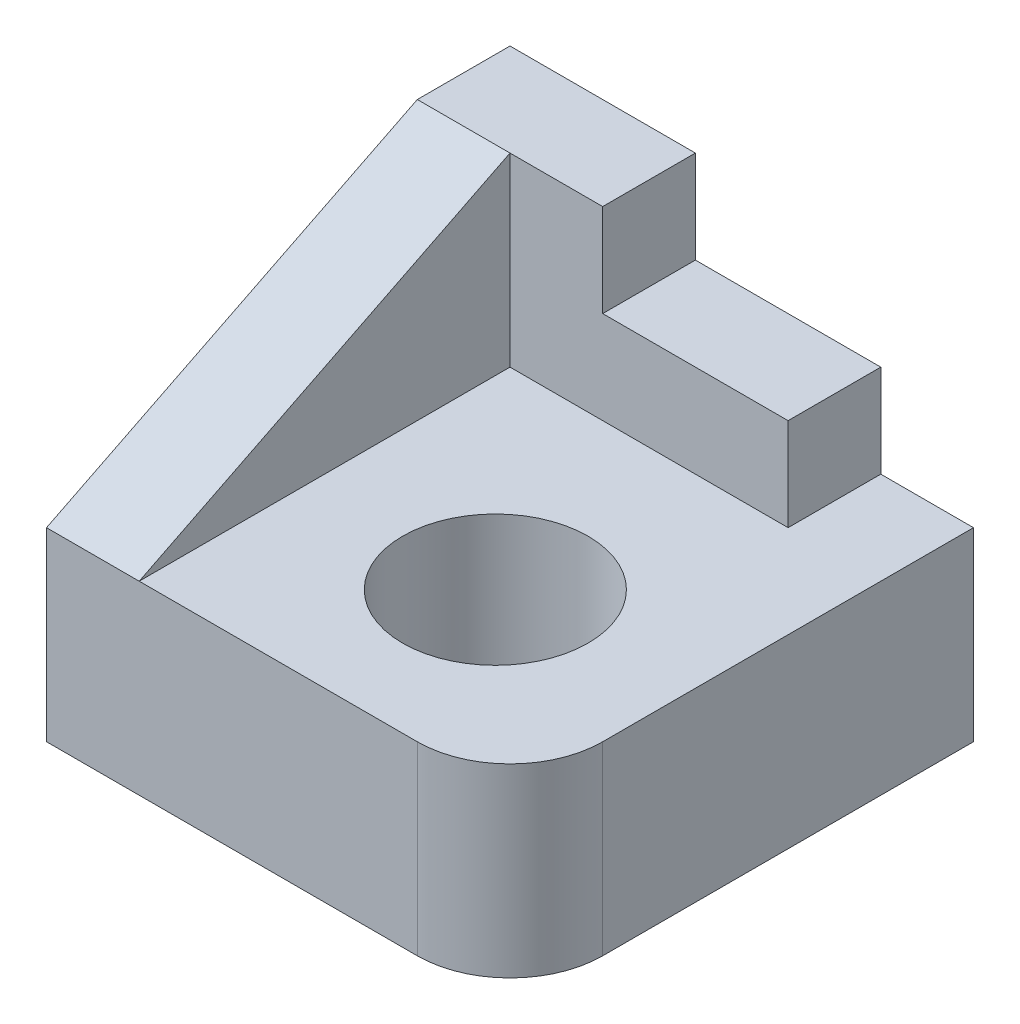
ISO-10303-21;
HEADER;
FILE_DESCRIPTION(('STEP AP214'),'2;1');
FILE_NAME('part.step','',(''),(''),'','','');
FILE_SCHEMA(('AUTOMOTIVE_DESIGN { 1 0 10303 214 1 1 1 1 }'));
ENDSEC;
DATA;
#1=APPLICATION_CONTEXT('core data for automotive mechanical design processes');
#2=APPLICATION_PROTOCOL_DEFINITION('international standard','automotive_design',2000,#1);
#3=PRODUCT_CONTEXT('',#1,'mechanical');
#4=PRODUCT('Part','Part','',(#3));
#5=PRODUCT_RELATED_PRODUCT_CATEGORY('part','',(#4));
#6=PRODUCT_DEFINITION_FORMATION('','',#4);
#7=PRODUCT_DEFINITION_CONTEXT('part definition',#1,'design');
#8=PRODUCT_DEFINITION('design','',#6,#7);
#9=PRODUCT_DEFINITION_SHAPE('','',#8);
#10=(LENGTH_UNIT() NAMED_UNIT(*) SI_UNIT(.MILLI.,.METRE.));
#11=(NAMED_UNIT(*) PLANE_ANGLE_UNIT() SI_UNIT($,.RADIAN.));
#12=(NAMED_UNIT(*) SI_UNIT($,.STERADIAN.) SOLID_ANGLE_UNIT());
#13=UNCERTAINTY_MEASURE_WITH_UNIT(LENGTH_MEASURE(1.E-05),#10,'distance_accuracy_value','');
#14=(GEOMETRIC_REPRESENTATION_CONTEXT(3) GLOBAL_UNCERTAINTY_ASSIGNED_CONTEXT((#13)) GLOBAL_UNIT_ASSIGNED_CONTEXT((#10,
#11,#12)) REPRESENTATION_CONTEXT('',''));
#15=CARTESIAN_POINT('',(0.,0.,0.));
#16=DIRECTION('',(0.,0.,1.));
#17=DIRECTION('',(1.,0.,0.));
#18=AXIS2_PLACEMENT_3D('',#15,#16,#17);
#19=CARTESIAN_POINT('',(10.,20.,8.41898408846751));
#20=DIRECTION('',(0.,1.,0.));
#21=DIRECTION('',(0.,0.,1.));
#22=AXIS2_PLACEMENT_3D('',#19,#20,#21);
#23=PLANE('',#22);
#24=DIRECTION('',(0.,0.,-1.));
#25=VECTOR('',#24,1.);
#26=CARTESIAN_POINT('',(9.99999999999999,20.,-21.5810159115325));
#27=LINE('',#26,#25);
#28=CARTESIAN_POINT('',(9.99999999999999,20.,-21.5810159115325));
#29=VERTEX_POINT('',#28);
#30=CARTESIAN_POINT('',(9.99999999999999,20.,-31.5810159115325));
#31=VERTEX_POINT('',#30);
#32=EDGE_CURVE('E55',#29,#31,#27,.T.);
#33=ORIENTED_EDGE('',*,*,#32,.F.);
#34=DIRECTION('',(-1.,0.,0.));
#35=VECTOR('',#34,1.);
#36=CARTESIAN_POINT('',(9.99999999999999,20.,-21.5810159115325));
#37=LINE('',#36,#35);
#38=CARTESIAN_POINT('',(-20.,20.,-21.5810159115325));
#39=VERTEX_POINT('',#38);
#40=EDGE_CURVE('E135',#29,#39,#37,.T.);
#41=ORIENTED_EDGE('',*,*,#40,.T.);
#42=DIRECTION('',(0.,0.,1.));
#43=VECTOR('',#42,1.);
#44=CARTESIAN_POINT('',(-20.,20.,18.4189840884675));
#45=LINE('',#44,#43);
#46=CARTESIAN_POINT('',(-20.,20.,18.4189840884675));
#47=VERTEX_POINT('',#46);
#48=EDGE_CURVE('E193',#39,#47,#45,.T.);
#49=ORIENTED_EDGE('',*,*,#48,.T.);
#50=DIRECTION('',(1.,0.,0.));
#51=VECTOR('',#50,1.);
#52=CARTESIAN_POINT('',(-30.,20.,18.4189840884675));
#53=LINE('',#52,#51);
#54=CARTESIAN_POINT('',(9.99999999999993,20.,18.4189840884675));
#55=VERTEX_POINT('',#54);
#56=EDGE_CURVE('E216',#47,#55,#53,.T.);
#57=ORIENTED_EDGE('',*,*,#56,.T.);
#58=CARTESIAN_POINT('',(10.,20.,8.41898408846751));
#59=DIRECTION('',(0.,1.,0.));
#60=DIRECTION('',(0.,0.,1.));
#61=AXIS2_PLACEMENT_3D('',#58,#59,#60);
#62=CIRCLE('',#61,10.);
#63=CARTESIAN_POINT('',(20.,20.,8.41898408846744));
#64=VERTEX_POINT('',#63);
#65=EDGE_CURVE('E215',#55,#64,#62,.T.);
#66=ORIENTED_EDGE('',*,*,#65,.T.);
#67=DIRECTION('',(0.,0.,-1.));
#68=VECTOR('',#67,1.);
#69=CARTESIAN_POINT('',(20.,20.,-31.5810159115325));
#70=LINE('',#69,#68);
#71=CARTESIAN_POINT('',(20.,20.,-31.5810159115325));
#72=VERTEX_POINT('',#71);
#73=EDGE_CURVE('E219',#64,#72,#70,.T.);
#74=ORIENTED_EDGE('',*,*,#73,.T.);
#75=DIRECTION('',(-1.,0.,0.));
#76=VECTOR('',#75,1.);
#77=CARTESIAN_POINT('',(-30.,20.,-31.5810159115325));
#78=LINE('',#77,#76);
#79=EDGE_CURVE('E60',#72,#31,#78,.T.);
#80=ORIENTED_EDGE('',*,*,#79,.T.);
#81=EDGE_LOOP('',(#33,#41,#49,#57,#66,#74,#80));
#82=FACE_BOUND('',#81,.T.);
#83=CARTESIAN_POINT('',(0.,20.,0.));
#84=DIRECTION('',(0.,1.,0.));
#85=DIRECTION('',(0.,0.,1.));
#86=AXIS2_PLACEMENT_3D('',#83,#84,#85);
#87=CIRCLE('',#86,10.);
#88=CARTESIAN_POINT('',(0.,20.,10.));
#89=VERTEX_POINT('',#88);
#90=EDGE_CURVE('E203',#89,#89,#87,.T.);
#91=ORIENTED_EDGE('',*,*,#90,.F.);
#92=EDGE_LOOP('',(#91));
#93=FACE_BOUND('',#92,.T.);
#94=ADVANCED_FACE('F39',(#82,#93),#23,.T.);
#95=CARTESIAN_POINT('',(10.,0.,8.41898408846751));
#96=DIRECTION('',(0.,1.,0.));
#97=DIRECTION('',(0.,0.,1.));
#98=AXIS2_PLACEMENT_3D('',#95,#96,#97);
#99=PLANE('',#98);
#100=DIRECTION('',(0.,0.,1.));
#101=VECTOR('',#100,1.);
#102=CARTESIAN_POINT('',(-30.,0.,-31.5810159115325));
#103=LINE('',#102,#101);
#104=CARTESIAN_POINT('',(-30.,0.,-31.5810159115325));
#105=VERTEX_POINT('',#104);
#106=CARTESIAN_POINT('',(-30.,0.,18.4189840884675));
#107=VERTEX_POINT('',#106);
#108=EDGE_CURVE('E207',#105,#107,#103,.T.);
#109=ORIENTED_EDGE('',*,*,#108,.F.);
#110=DIRECTION('',(-1.,0.,0.));
#111=VECTOR('',#110,1.);
#112=CARTESIAN_POINT('',(-30.,0.,-31.5810159115325));
#113=LINE('',#112,#111);
#114=CARTESIAN_POINT('',(20.,0.,-31.5810159115325));
#115=VERTEX_POINT('',#114);
#116=EDGE_CURVE('E237',#115,#105,#113,.T.);
#117=ORIENTED_EDGE('',*,*,#116,.F.);
#118=DIRECTION('',(0.,0.,-1.));
#119=VECTOR('',#118,1.);
#120=CARTESIAN_POINT('',(20.,0.,-31.5810159115325));
#121=LINE('',#120,#119);
#122=CARTESIAN_POINT('',(20.,0.,8.41898408846744));
#123=VERTEX_POINT('',#122);
#124=EDGE_CURVE('E234',#123,#115,#121,.T.);
#125=ORIENTED_EDGE('',*,*,#124,.F.);
#126=CARTESIAN_POINT('',(10.,0.,8.41898408846751));
#127=DIRECTION('',(0.,1.,0.));
#128=DIRECTION('',(0.,0.,1.));
#129=AXIS2_PLACEMENT_3D('',#126,#127,#128);
#130=CIRCLE('',#129,10.);
#131=CARTESIAN_POINT('',(9.99999999999993,0.,18.4189840884675));
#132=VERTEX_POINT('',#131);
#133=EDGE_CURVE('E231',#132,#123,#130,.T.);
#134=ORIENTED_EDGE('',*,*,#133,.F.);
#135=DIRECTION('',(1.,0.,0.));
#136=VECTOR('',#135,1.);
#137=CARTESIAN_POINT('',(-30.,0.,18.4189840884675));
#138=LINE('',#137,#136);
#139=EDGE_CURVE('E228',#107,#132,#138,.T.);
#140=ORIENTED_EDGE('',*,*,#139,.F.);
#141=EDGE_LOOP('',(#109,#117,#125,#134,#140));
#142=FACE_BOUND('',#141,.T.);
#143=CARTESIAN_POINT('',(0.,0.,0.));
#144=DIRECTION('',(0.,1.,0.));
#145=DIRECTION('',(0.,0.,1.));
#146=AXIS2_PLACEMENT_3D('',#143,#144,#145);
#147=CIRCLE('',#146,10.);
#148=CARTESIAN_POINT('',(0.,0.,10.));
#149=VERTEX_POINT('',#148);
#150=EDGE_CURVE('E202',#149,#149,#147,.T.);
#151=ORIENTED_EDGE('',*,*,#150,.T.);
#152=EDGE_LOOP('',(#151));
#153=FACE_BOUND('',#152,.T.);
#154=ADVANCED_FACE('F263',(#142,#153),#99,.F.);
#155=CARTESIAN_POINT('',(-30.,20.,-31.5810159115325));
#156=DIRECTION('',(1.,0.,0.));
#157=DIRECTION('',(0.,0.,-1.));
#158=AXIS2_PLACEMENT_3D('',#155,#156,#157);
#159=PLANE('',#158);
#160=ORIENTED_EDGE('',*,*,#108,.T.);
#161=DIRECTION('',(0.,-1.,0.));
#162=VECTOR('',#161,1.);
#163=CARTESIAN_POINT('',(-30.,20.,18.4189840884675));
#164=LINE('',#163,#162);
#165=CARTESIAN_POINT('',(-30.,20.,18.4189840884675));
#166=VERTEX_POINT('',#165);
#167=EDGE_CURVE('E11',#166,#107,#164,.T.);
#168=ORIENTED_EDGE('',*,*,#167,.F.);
#169=DIRECTION('',(0.,0.447213595499958,-0.894427190999916));
#170=VECTOR('',#169,1.);
#171=CARTESIAN_POINT('',(-30.,40.,-21.5810159115325));
#172=LINE('',#171,#170);
#173=CARTESIAN_POINT('',(-30.,40.,-21.5810159115325));
#174=VERTEX_POINT('',#173);
#175=EDGE_CURVE('E177',#166,#174,#172,.T.);
#176=ORIENTED_EDGE('',*,*,#175,.T.);
#177=DIRECTION('',(0.,0.,-1.));
#178=VECTOR('',#177,1.);
#179=CARTESIAN_POINT('',(-30.,40.,-21.5810159115325));
#180=LINE('',#179,#178);
#181=CARTESIAN_POINT('',(-30.,40.,-31.5810159115325));
#182=VERTEX_POINT('',#181);
#183=EDGE_CURVE('E145',#174,#182,#180,.T.);
#184=ORIENTED_EDGE('',*,*,#183,.T.);
#185=DIRECTION('',(0.,-1.,0.));
#186=VECTOR('',#185,1.);
#187=CARTESIAN_POINT('',(-30.,20.,-31.5810159115325));
#188=LINE('',#187,#186);
#189=EDGE_CURVE('E224',#182,#105,#188,.T.);
#190=ORIENTED_EDGE('',*,*,#189,.T.);
#191=EDGE_LOOP('',(#160,#168,#176,#184,#190));
#192=FACE_BOUND('',#191,.T.);
#193=ADVANCED_FACE('F41',(#192),#159,.F.);
#194=CARTESIAN_POINT('',(-30.,20.,18.4189840884675));
#195=DIRECTION('',(0.,0.,-1.));
#196=DIRECTION('',(-1.,0.,0.));
#197=AXIS2_PLACEMENT_3D('',#194,#195,#196);
#198=PLANE('',#197);
#199=ORIENTED_EDGE('',*,*,#139,.T.);
#200=DIRECTION('',(0.,-1.,0.));
#201=VECTOR('',#200,1.);
#202=CARTESIAN_POINT('',(9.99999999999993,20.,18.4189840884675));
#203=LINE('',#202,#201);
#204=EDGE_CURVE('E48',#55,#132,#203,.T.);
#205=ORIENTED_EDGE('',*,*,#204,.F.);
#206=ORIENTED_EDGE('',*,*,#56,.F.);
#207=EDGE_CURVE('E211',#166,#47,#53,.T.);
#208=ORIENTED_EDGE('',*,*,#207,.F.);
#209=ORIENTED_EDGE('',*,*,#167,.T.);
#210=EDGE_LOOP('',(#199,#205,#206,#208,#209));
#211=FACE_BOUND('',#210,.T.);
#212=ADVANCED_FACE('F280',(#211),#198,.F.);
#213=CARTESIAN_POINT('',(10.,20.,8.41898408846751));
#214=DIRECTION('',(0.,-1.,0.));
#215=DIRECTION('',(0.,0.,-1.));
#216=AXIS2_PLACEMENT_3D('',#213,#214,#215);
#217=CYLINDRICAL_SURFACE('',#216,10.);
#218=ORIENTED_EDGE('',*,*,#133,.T.);
#219=DIRECTION('',(0.,-1.,0.));
#220=VECTOR('',#219,1.);
#221=CARTESIAN_POINT('',(20.,20.,8.41898408846744));
#222=LINE('',#221,#220);
#223=EDGE_CURVE('E247',#64,#123,#222,.T.);
#224=ORIENTED_EDGE('',*,*,#223,.F.);
#225=ORIENTED_EDGE('',*,*,#65,.F.);
#226=ORIENTED_EDGE('',*,*,#204,.T.);
#227=EDGE_LOOP('',(#218,#224,#225,#226));
#228=FACE_BOUND('',#227,.T.);
#229=ADVANCED_FACE('F256',(#228),#217,.T.);
#230=CARTESIAN_POINT('',(20.,20.,-31.5810159115325));
#231=DIRECTION('',(-1.,0.,0.));
#232=DIRECTION('',(0.,0.,1.));
#233=AXIS2_PLACEMENT_3D('',#230,#231,#232);
#234=PLANE('',#233);
#235=ORIENTED_EDGE('',*,*,#124,.T.);
#236=DIRECTION('',(0.,-1.,0.));
#237=VECTOR('',#236,1.);
#238=CARTESIAN_POINT('',(20.,20.,-31.5810159115325));
#239=LINE('',#238,#237);
#240=EDGE_CURVE('E243',#72,#115,#239,.T.);
#241=ORIENTED_EDGE('',*,*,#240,.F.);
#242=ORIENTED_EDGE('',*,*,#73,.F.);
#243=ORIENTED_EDGE('',*,*,#223,.T.);
#244=EDGE_LOOP('',(#235,#241,#242,#243));
#245=FACE_BOUND('',#244,.T.);
#246=ADVANCED_FACE('F268',(#245),#234,.F.);
#247=CARTESIAN_POINT('',(-30.,20.,-31.5810159115325));
#248=DIRECTION('',(0.,0.,1.));
#249=DIRECTION('',(1.,0.,0.));
#250=AXIS2_PLACEMENT_3D('',#247,#248,#249);
#251=PLANE('',#250);
#252=ORIENTED_EDGE('',*,*,#116,.T.);
#253=ORIENTED_EDGE('',*,*,#189,.F.);
#254=DIRECTION('',(1.,0.,0.));
#255=VECTOR('',#254,1.);
#256=CARTESIAN_POINT('',(-30.,40.,-31.5810159115325));
#257=LINE('',#256,#255);
#258=CARTESIAN_POINT('',(-10.,40.,-31.5810159115325));
#259=VERTEX_POINT('',#258);
#260=EDGE_CURVE('E162',#182,#259,#257,.T.);
#261=ORIENTED_EDGE('',*,*,#260,.T.);
#262=DIRECTION('',(0.,-1.,0.));
#263=VECTOR('',#262,1.);
#264=CARTESIAN_POINT('',(-10.,40.,-31.5810159115325));
#265=LINE('',#264,#263);
#266=CARTESIAN_POINT('',(-10.,30.,-31.5810159115325));
#267=VERTEX_POINT('',#266);
#268=EDGE_CURVE('E141',#259,#267,#265,.T.);
#269=ORIENTED_EDGE('',*,*,#268,.T.);
#270=DIRECTION('',(1.,0.,0.));
#271=VECTOR('',#270,1.);
#272=CARTESIAN_POINT('',(-10.,30.,-31.5810159115325));
#273=LINE('',#272,#271);
#274=CARTESIAN_POINT('',(9.99999999999999,30.,-31.5810159115325));
#275=VERTEX_POINT('',#274);
#276=EDGE_CURVE('E167',#267,#275,#273,.T.);
#277=ORIENTED_EDGE('',*,*,#276,.T.);
#278=DIRECTION('',(0.,-1.,0.));
#279=VECTOR('',#278,1.);
#280=CARTESIAN_POINT('',(9.99999999999999,30.,-31.5810159115325));
#281=LINE('',#280,#279);
#282=EDGE_CURVE('E171',#275,#31,#281,.T.);
#283=ORIENTED_EDGE('',*,*,#282,.T.);
#284=ORIENTED_EDGE('',*,*,#79,.F.);
#285=ORIENTED_EDGE('',*,*,#240,.T.);
#286=EDGE_LOOP('',(#252,#253,#261,#269,#277,#283,#284,#285));
#287=FACE_BOUND('',#286,.T.);
#288=ADVANCED_FACE('F271',(#287),#251,.F.);
#289=CARTESIAN_POINT('',(0.,20.,0.));
#290=DIRECTION('',(0.,-1.,0.));
#291=DIRECTION('',(0.,0.,-1.));
#292=AXIS2_PLACEMENT_3D('',#289,#290,#291);
#293=CYLINDRICAL_SURFACE('',#292,10.);
#294=ORIENTED_EDGE('',*,*,#90,.T.);
#295=EDGE_LOOP('',(#294));
#296=FACE_BOUND('',#295,.T.);
#297=ORIENTED_EDGE('',*,*,#150,.F.);
#298=EDGE_LOOP('',(#297));
#299=FACE_BOUND('',#298,.T.);
#300=ADVANCED_FACE('F294',(#296,#299),#293,.F.);
#301=CARTESIAN_POINT('',(-20.,40.,-21.5810159115325));
#302=DIRECTION('',(0.,0.894427190999916,0.447213595499958));
#303=DIRECTION('',(0.,-0.447213595499958,0.894427190999916));
#304=AXIS2_PLACEMENT_3D('',#301,#302,#303);
#305=PLANE('',#304);
#306=ORIENTED_EDGE('',*,*,#175,.F.);
#307=ORIENTED_EDGE('',*,*,#207,.T.);
#308=DIRECTION('',(0.,0.447213595499958,-0.894427190999916));
#309=VECTOR('',#308,1.);
#310=CARTESIAN_POINT('',(-20.,40.,-21.5810159115325));
#311=LINE('',#310,#309);
#312=CARTESIAN_POINT('',(-20.,40.,-21.5810159115325));
#313=VERTEX_POINT('',#312);
#314=EDGE_CURVE('E186',#47,#313,#311,.T.);
#315=ORIENTED_EDGE('',*,*,#314,.T.);
#316=DIRECTION('',(-1.,0.,0.));
#317=VECTOR('',#316,1.);
#318=CARTESIAN_POINT('',(-20.,40.,-21.5810159115325));
#319=LINE('',#318,#317);
#320=EDGE_CURVE('E129',#313,#174,#319,.T.);
#321=ORIENTED_EDGE('',*,*,#320,.T.);
#322=EDGE_LOOP('',(#306,#307,#315,#321));
#323=FACE_BOUND('',#322,.T.);
#324=ADVANCED_FACE('F285',(#323),#305,.T.);
#325=CARTESIAN_POINT('',(-20.,0.,0.));
#326=DIRECTION('',(-1.,0.,0.));
#327=DIRECTION('',(0.,0.,1.));
#328=AXIS2_PLACEMENT_3D('',#325,#326,#327);
#329=PLANE('',#328);
#330=ORIENTED_EDGE('',*,*,#314,.F.);
#331=ORIENTED_EDGE('',*,*,#48,.F.);
#332=DIRECTION('',(0.,-1.,0.));
#333=VECTOR('',#332,1.);
#334=CARTESIAN_POINT('',(-20.,20.,-21.5810159115325));
#335=LINE('',#334,#333);
#336=EDGE_CURVE('E190',#313,#39,#335,.T.);
#337=ORIENTED_EDGE('',*,*,#336,.F.);
#338=EDGE_LOOP('',(#330,#331,#337));
#339=FACE_BOUND('',#338,.T.);
#340=ADVANCED_FACE('F286',(#339),#329,.F.);
#341=CARTESIAN_POINT('',(0.,0.,-21.5810159115325));
#342=DIRECTION('',(0.,0.,-1.));
#343=DIRECTION('',(-1.,0.,0.));
#344=AXIS2_PLACEMENT_3D('',#341,#342,#343);
#345=PLANE('',#344);
#346=DIRECTION('',(1.,0.,0.));
#347=VECTOR('',#346,1.);
#348=CARTESIAN_POINT('',(-30.,40.,-21.5810159115325));
#349=LINE('',#348,#347);
#350=CARTESIAN_POINT('',(-10.,40.,-21.5810159115325));
#351=VERTEX_POINT('',#350);
#352=EDGE_CURVE('E122',#313,#351,#349,.T.);
#353=ORIENTED_EDGE('',*,*,#352,.F.);
#354=ORIENTED_EDGE('',*,*,#336,.T.);
#355=ORIENTED_EDGE('',*,*,#40,.F.);
#356=DIRECTION('',(0.,-1.,0.));
#357=VECTOR('',#356,1.);
#358=CARTESIAN_POINT('',(9.99999999999999,30.,-21.5810159115325));
#359=LINE('',#358,#357);
#360=CARTESIAN_POINT('',(9.99999999999999,30.,-21.5810159115325));
#361=VERTEX_POINT('',#360);
#362=EDGE_CURVE('E155',#361,#29,#359,.T.);
#363=ORIENTED_EDGE('',*,*,#362,.F.);
#364=DIRECTION('',(1.,0.,0.));
#365=VECTOR('',#364,1.);
#366=CARTESIAN_POINT('',(-10.,30.,-21.5810159115325));
#367=LINE('',#366,#365);
#368=CARTESIAN_POINT('',(-10.,30.,-21.5810159115325));
#369=VERTEX_POINT('',#368);
#370=EDGE_CURVE('E151',#369,#361,#367,.T.);
#371=ORIENTED_EDGE('',*,*,#370,.F.);
#372=DIRECTION('',(0.,-1.,0.));
#373=VECTOR('',#372,1.);
#374=CARTESIAN_POINT('',(-10.,40.,-21.5810159115325));
#375=LINE('',#374,#373);
#376=EDGE_CURVE('E134',#351,#369,#375,.T.);
#377=ORIENTED_EDGE('',*,*,#376,.F.);
#378=EDGE_LOOP('',(#353,#354,#355,#363,#371,#377));
#379=FACE_BOUND('',#378,.T.);
#380=ADVANCED_FACE('F148',(#379),#345,.F.);
#381=CARTESIAN_POINT('',(9.99999999999999,30.,-21.5810159115325));
#382=DIRECTION('',(1.,0.,0.));
#383=DIRECTION('',(0.,1.,0.));
#384=AXIS2_PLACEMENT_3D('',#381,#382,#383);
#385=PLANE('',#384);
#386=ORIENTED_EDGE('',*,*,#282,.F.);
#387=DIRECTION('',(0.,0.,-1.));
#388=VECTOR('',#387,1.);
#389=CARTESIAN_POINT('',(9.99999999999999,30.,-21.5810159115325));
#390=LINE('',#389,#388);
#391=EDGE_CURVE('E178',#361,#275,#390,.T.);
#392=ORIENTED_EDGE('',*,*,#391,.F.);
#393=ORIENTED_EDGE('',*,*,#362,.T.);
#394=ORIENTED_EDGE('',*,*,#32,.T.);
#395=EDGE_LOOP('',(#386,#392,#393,#394));
#396=FACE_BOUND('',#395,.T.);
#397=ADVANCED_FACE('F275',(#396),#385,.T.);
#398=CARTESIAN_POINT('',(-10.,30.,-21.5810159115325));
#399=DIRECTION('',(0.,1.,0.));
#400=DIRECTION('',(-1.,0.,0.));
#401=AXIS2_PLACEMENT_3D('',#398,#399,#400);
#402=PLANE('',#401);
#403=ORIENTED_EDGE('',*,*,#276,.F.);
#404=DIRECTION('',(0.,0.,-1.));
#405=VECTOR('',#404,1.);
#406=CARTESIAN_POINT('',(-10.,30.,-21.5810159115325));
#407=LINE('',#406,#405);
#408=EDGE_CURVE('E144',#369,#267,#407,.T.);
#409=ORIENTED_EDGE('',*,*,#408,.F.);
#410=ORIENTED_EDGE('',*,*,#370,.T.);
#411=ORIENTED_EDGE('',*,*,#391,.T.);
#412=EDGE_LOOP('',(#403,#409,#410,#411));
#413=FACE_BOUND('',#412,.T.);
#414=ADVANCED_FACE('F383',(#413),#402,.T.);
#415=CARTESIAN_POINT('',(-10.,40.,-21.5810159115325));
#416=DIRECTION('',(1.,0.,0.));
#417=DIRECTION('',(0.,1.,0.));
#418=AXIS2_PLACEMENT_3D('',#415,#416,#417);
#419=PLANE('',#418);
#420=ORIENTED_EDGE('',*,*,#268,.F.);
#421=DIRECTION('',(0.,0.,-1.));
#422=VECTOR('',#421,1.);
#423=CARTESIAN_POINT('',(-10.,40.,-21.5810159115325));
#424=LINE('',#423,#422);
#425=EDGE_CURVE('E126',#351,#259,#424,.T.);
#426=ORIENTED_EDGE('',*,*,#425,.F.);
#427=ORIENTED_EDGE('',*,*,#376,.T.);
#428=ORIENTED_EDGE('',*,*,#408,.T.);
#429=EDGE_LOOP('',(#420,#426,#427,#428));
#430=FACE_BOUND('',#429,.T.);
#431=ADVANCED_FACE('F139',(#430),#419,.T.);
#432=CARTESIAN_POINT('',(-30.,40.,-21.5810159115325));
#433=DIRECTION('',(0.,1.,0.));
#434=DIRECTION('',(0.,0.,1.));
#435=AXIS2_PLACEMENT_3D('',#432,#433,#434);
#436=PLANE('',#435);
#437=ORIENTED_EDGE('',*,*,#260,.F.);
#438=ORIENTED_EDGE('',*,*,#183,.F.);
#439=ORIENTED_EDGE('',*,*,#320,.F.);
#440=ORIENTED_EDGE('',*,*,#352,.T.);
#441=ORIENTED_EDGE('',*,*,#425,.T.);
#442=EDGE_LOOP('',(#437,#438,#439,#440,#441));
#443=FACE_BOUND('',#442,.T.);
#444=ADVANCED_FACE('F125',(#443),#436,.T.);
#445=CLOSED_SHELL('',(#94,#154,#193,#212,#229,#246,#288,#300,#324,#340,#380,#397,#414,#431,#444));
#446=MANIFOLD_SOLID_BREP('B2',#445);
#447=ADVANCED_BREP_SHAPE_REPRESENTATION('',(#18,#446),#14);
#448=SHAPE_DEFINITION_REPRESENTATION(#9,#447);
ENDSEC;
END-ISO-10303-21;
